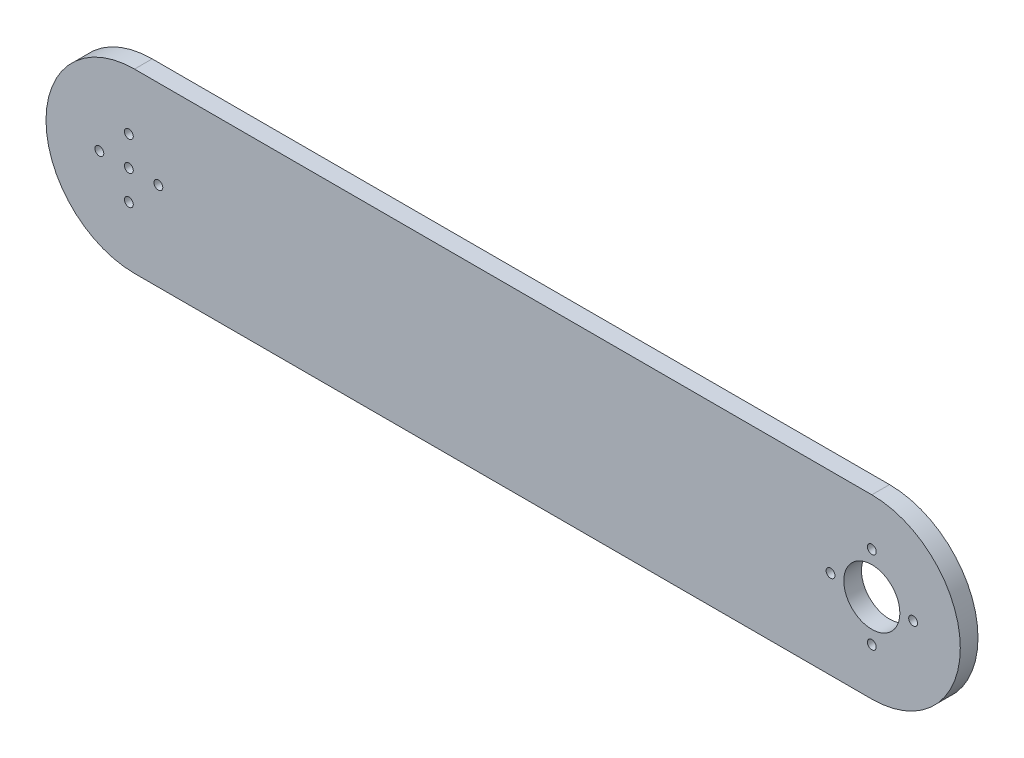
ISO-10303-21;
HEADER;
FILE_DESCRIPTION(('STEP AP214'),'2;1');
FILE_NAME('part.step','',(''),(''),'','','');
FILE_SCHEMA(('AUTOMOTIVE_DESIGN { 1 0 10303 214 1 1 1 1 }'));
ENDSEC;
DATA;
#1=APPLICATION_CONTEXT('core data for automotive mechanical design processes');
#2=APPLICATION_PROTOCOL_DEFINITION('international standard','automotive_design',2000,#1);
#3=PRODUCT_CONTEXT('',#1,'mechanical');
#4=PRODUCT('Part','Part','',(#3));
#5=PRODUCT_RELATED_PRODUCT_CATEGORY('part','',(#4));
#6=PRODUCT_DEFINITION_FORMATION('','',#4);
#7=PRODUCT_DEFINITION_CONTEXT('part definition',#1,'design');
#8=PRODUCT_DEFINITION('design','',#6,#7);
#9=PRODUCT_DEFINITION_SHAPE('','',#8);
#10=(LENGTH_UNIT() NAMED_UNIT(*) SI_UNIT(.MILLI.,.METRE.));
#11=(NAMED_UNIT(*) PLANE_ANGLE_UNIT() SI_UNIT($,.RADIAN.));
#12=(NAMED_UNIT(*) SI_UNIT($,.STERADIAN.) SOLID_ANGLE_UNIT());
#13=UNCERTAINTY_MEASURE_WITH_UNIT(LENGTH_MEASURE(1.E-05),#10,'distance_accuracy_value','');
#14=(GEOMETRIC_REPRESENTATION_CONTEXT(3) GLOBAL_UNCERTAINTY_ASSIGNED_CONTEXT((#13)) GLOBAL_UNIT_ASSIGNED_CONTEXT((#10,
#11,#12)) REPRESENTATION_CONTEXT('',''));
#15=CARTESIAN_POINT('',(0.,0.,0.));
#16=DIRECTION('',(0.,0.,1.));
#17=DIRECTION('',(1.,0.,0.));
#18=AXIS2_PLACEMENT_3D('',#15,#16,#17);
#19=CARTESIAN_POINT('',(370.,30.,6.));
#20=DIRECTION('',(0.,0.,-1.));
#21=DIRECTION('',(-1.,0.,0.));
#22=AXIS2_PLACEMENT_3D('',#19,#20,#21);
#23=CYLINDRICAL_SURFACE('',#22,30.);
#24=CARTESIAN_POINT('',(370.,30.,0.));
#25=DIRECTION('',(0.,0.,1.));
#26=DIRECTION('',(-1.,0.,0.));
#27=AXIS2_PLACEMENT_3D('',#24,#25,#26);
#28=CIRCLE('',#27,30.);
#29=CARTESIAN_POINT('',(370.,0.,0.));
#30=VERTEX_POINT('',#29);
#31=CARTESIAN_POINT('',(370.,60.,0.));
#32=VERTEX_POINT('',#31);
#33=EDGE_CURVE('E116',#30,#32,#28,.T.);
#34=ORIENTED_EDGE('',*,*,#33,.T.);
#35=DIRECTION('',(0.,0.,-1.));
#36=VECTOR('',#35,1.);
#37=CARTESIAN_POINT('',(370.,60.,6.));
#38=LINE('',#37,#36);
#39=CARTESIAN_POINT('',(370.,60.,6.));
#40=VERTEX_POINT('',#39);
#41=EDGE_CURVE('E12',#40,#32,#38,.T.);
#42=ORIENTED_EDGE('',*,*,#41,.F.);
#43=CARTESIAN_POINT('',(370.,30.,6.));
#44=DIRECTION('',(0.,0.,1.));
#45=DIRECTION('',(-1.,0.,0.));
#46=AXIS2_PLACEMENT_3D('',#43,#44,#45);
#47=CIRCLE('',#46,30.);
#48=CARTESIAN_POINT('',(370.,0.,6.));
#49=VERTEX_POINT('',#48);
#50=EDGE_CURVE('E103',#49,#40,#47,.T.);
#51=ORIENTED_EDGE('',*,*,#50,.F.);
#52=DIRECTION('',(0.,0.,-1.));
#53=VECTOR('',#52,1.);
#54=CARTESIAN_POINT('',(370.,0.,6.));
#55=LINE('',#54,#53);
#56=EDGE_CURVE('E112',#49,#30,#55,.T.);
#57=ORIENTED_EDGE('',*,*,#56,.T.);
#58=EDGE_LOOP('',(#34,#42,#51,#57));
#59=FACE_BOUND('',#58,.T.);
#60=ADVANCED_FACE('F48',(#59),#23,.T.);
#61=CARTESIAN_POINT('',(120.,60.,6.));
#62=DIRECTION('',(0.,-1.,0.));
#63=DIRECTION('',(0.,0.,-1.));
#64=AXIS2_PLACEMENT_3D('',#61,#62,#63);
#65=PLANE('',#64);
#66=DIRECTION('',(-1.,0.,0.));
#67=VECTOR('',#66,1.);
#68=CARTESIAN_POINT('',(120.,60.,0.));
#69=LINE('',#68,#67);
#70=CARTESIAN_POINT('',(120.,60.,0.));
#71=VERTEX_POINT('',#70);
#72=EDGE_CURVE('E107',#32,#71,#69,.T.);
#73=ORIENTED_EDGE('',*,*,#72,.T.);
#74=DIRECTION('',(0.,0.,-1.));
#75=VECTOR('',#74,1.);
#76=CARTESIAN_POINT('',(120.,60.,6.));
#77=LINE('',#76,#75);
#78=CARTESIAN_POINT('',(120.,60.,6.));
#79=VERTEX_POINT('',#78);
#80=EDGE_CURVE('E59',#79,#71,#77,.T.);
#81=ORIENTED_EDGE('',*,*,#80,.F.);
#82=DIRECTION('',(-1.,0.,0.));
#83=VECTOR('',#82,1.);
#84=CARTESIAN_POINT('',(120.,60.,6.));
#85=LINE('',#84,#83);
#86=EDGE_CURVE('E98',#40,#79,#85,.T.);
#87=ORIENTED_EDGE('',*,*,#86,.F.);
#88=ORIENTED_EDGE('',*,*,#41,.T.);
#89=EDGE_LOOP('',(#73,#81,#87,#88));
#90=FACE_BOUND('',#89,.T.);
#91=ADVANCED_FACE('F106',(#90),#65,.F.);
#92=CARTESIAN_POINT('',(120.,30.,6.));
#93=DIRECTION('',(0.,0.,-1.));
#94=DIRECTION('',(-1.,0.,0.));
#95=AXIS2_PLACEMENT_3D('',#92,#93,#94);
#96=CYLINDRICAL_SURFACE('',#95,30.);
#97=CARTESIAN_POINT('',(120.,30.,0.));
#98=DIRECTION('',(0.,0.,1.));
#99=DIRECTION('',(1.,0.,0.));
#100=AXIS2_PLACEMENT_3D('',#97,#98,#99);
#101=CIRCLE('',#100,30.);
#102=CARTESIAN_POINT('',(120.,0.,0.));
#103=VERTEX_POINT('',#102);
#104=EDGE_CURVE('E85',#71,#103,#101,.T.);
#105=ORIENTED_EDGE('',*,*,#104,.T.);
#106=DIRECTION('',(0.,0.,-1.));
#107=VECTOR('',#106,1.);
#108=CARTESIAN_POINT('',(120.,0.,6.));
#109=LINE('',#108,#107);
#110=CARTESIAN_POINT('',(120.,0.,6.));
#111=VERTEX_POINT('',#110);
#112=EDGE_CURVE('E108',#111,#103,#109,.T.);
#113=ORIENTED_EDGE('',*,*,#112,.F.);
#114=CARTESIAN_POINT('',(120.,30.,6.));
#115=DIRECTION('',(0.,0.,1.));
#116=DIRECTION('',(1.,0.,0.));
#117=AXIS2_PLACEMENT_3D('',#114,#115,#116);
#118=CIRCLE('',#117,30.);
#119=EDGE_CURVE('E101',#79,#111,#118,.T.);
#120=ORIENTED_EDGE('',*,*,#119,.F.);
#121=ORIENTED_EDGE('',*,*,#80,.T.);
#122=EDGE_LOOP('',(#105,#113,#120,#121));
#123=FACE_BOUND('',#122,.T.);
#124=ADVANCED_FACE('F110',(#123),#96,.T.);
#125=CARTESIAN_POINT('',(120.,0.,6.));
#126=DIRECTION('',(0.,1.,0.));
#127=DIRECTION('',(0.,0.,1.));
#128=AXIS2_PLACEMENT_3D('',#125,#126,#127);
#129=PLANE('',#128);
#130=DIRECTION('',(1.,0.,0.));
#131=VECTOR('',#130,1.);
#132=CARTESIAN_POINT('',(120.,0.,0.));
#133=LINE('',#132,#131);
#134=EDGE_CURVE('E91',#103,#30,#133,.T.);
#135=ORIENTED_EDGE('',*,*,#134,.T.);
#136=ORIENTED_EDGE('',*,*,#56,.F.);
#137=DIRECTION('',(1.,0.,0.));
#138=VECTOR('',#137,1.);
#139=CARTESIAN_POINT('',(120.,0.,6.));
#140=LINE('',#139,#138);
#141=EDGE_CURVE('E68',#111,#49,#140,.T.);
#142=ORIENTED_EDGE('',*,*,#141,.F.);
#143=ORIENTED_EDGE('',*,*,#112,.T.);
#144=EDGE_LOOP('',(#135,#136,#142,#143));
#145=FACE_BOUND('',#144,.T.);
#146=ADVANCED_FACE('F288',(#145),#129,.F.);
#147=CARTESIAN_POINT('',(370.,30.,6.));
#148=DIRECTION('',(0.,0.,-1.));
#149=DIRECTION('',(-1.,0.,0.));
#150=AXIS2_PLACEMENT_3D('',#147,#148,#149);
#151=PLANE('',#150);
#152=CARTESIAN_POINT('',(118.094100000006,19.9999999999992,6.));
#153=DIRECTION('',(0.,0.,-1.));
#154=DIRECTION('',(-1.,0.,0.));
#155=AXIS2_PLACEMENT_3D('',#152,#153,#154);
#156=CIRCLE('',#155,1.5);
#157=CARTESIAN_POINT('',(116.594100000006,19.9999999999992,6.));
#158=VERTEX_POINT('',#157);
#159=EDGE_CURVE('E181',#158,#158,#156,.T.);
#160=ORIENTED_EDGE('',*,*,#159,.T.);
#161=EDGE_LOOP('',(#160));
#162=FACE_BOUND('',#161,.T.);
#163=CARTESIAN_POINT('',(118.094100000006,39.9999999999993,6.));
#164=DIRECTION('',(0.,0.,-1.));
#165=DIRECTION('',(-1.,0.,0.));
#166=AXIS2_PLACEMENT_3D('',#163,#164,#165);
#167=CIRCLE('',#166,1.5);
#168=CARTESIAN_POINT('',(116.594100000006,39.9999999999993,6.));
#169=VERTEX_POINT('',#168);
#170=EDGE_CURVE('E709',#169,#169,#167,.T.);
#171=ORIENTED_EDGE('',*,*,#170,.T.);
#172=EDGE_LOOP('',(#171));
#173=FACE_BOUND('',#172,.T.);
#174=CARTESIAN_POINT('',(128.094100000006,29.9999999999993,6.));
#175=DIRECTION('',(0.,0.,-1.));
#176=DIRECTION('',(-1.,0.,0.));
#177=AXIS2_PLACEMENT_3D('',#174,#175,#176);
#178=CIRCLE('',#177,1.5);
#179=CARTESIAN_POINT('',(126.594100000006,29.9999999999993,6.));
#180=VERTEX_POINT('',#179);
#181=EDGE_CURVE('E699',#180,#180,#178,.T.);
#182=ORIENTED_EDGE('',*,*,#181,.T.);
#183=EDGE_LOOP('',(#182));
#184=FACE_BOUND('',#183,.T.);
#185=CARTESIAN_POINT('',(118.094100000006,29.9999999999993,6.));
#186=DIRECTION('',(0.,0.,-1.));
#187=DIRECTION('',(-1.,0.,0.));
#188=AXIS2_PLACEMENT_3D('',#185,#186,#187);
#189=CIRCLE('',#188,1.5);
#190=CARTESIAN_POINT('',(116.594100000006,29.9999999999993,6.));
#191=VERTEX_POINT('',#190);
#192=EDGE_CURVE('E698',#191,#191,#189,.T.);
#193=ORIENTED_EDGE('',*,*,#192,.T.);
#194=EDGE_LOOP('',(#193));
#195=FACE_BOUND('',#194,.T.);
#196=CARTESIAN_POINT('',(108.094100000006,29.9999999999993,6.));
#197=DIRECTION('',(0.,0.,-1.));
#198=DIRECTION('',(-1.,0.,0.));
#199=AXIS2_PLACEMENT_3D('',#196,#197,#198);
#200=CIRCLE('',#199,1.5);
#201=CARTESIAN_POINT('',(106.594100000006,29.9999999999993,6.));
#202=VERTEX_POINT('',#201);
#203=EDGE_CURVE('E715',#202,#202,#200,.T.);
#204=ORIENTED_EDGE('',*,*,#203,.T.);
#205=EDGE_LOOP('',(#204));
#206=FACE_BOUND('',#205,.T.);
#207=CARTESIAN_POINT('',(370.,16.,6.));
#208=DIRECTION('',(0.,0.,1.));
#209=DIRECTION('',(1.,0.,0.));
#210=AXIS2_PLACEMENT_3D('',#207,#208,#209);
#211=CIRCLE('',#210,1.50000000000002);
#212=CARTESIAN_POINT('',(371.5,16.,6.));
#213=VERTEX_POINT('',#212);
#214=EDGE_CURVE('E599',#213,#213,#211,.T.);
#215=ORIENTED_EDGE('',*,*,#214,.F.);
#216=EDGE_LOOP('',(#215));
#217=FACE_BOUND('',#216,.T.);
#218=CARTESIAN_POINT('',(384.,30.,6.));
#219=DIRECTION('',(0.,0.,1.));
#220=DIRECTION('',(1.,0.,0.));
#221=AXIS2_PLACEMENT_3D('',#218,#219,#220);
#222=CIRCLE('',#221,1.50000000000002);
#223=CARTESIAN_POINT('',(385.5,30.,6.));
#224=VERTEX_POINT('',#223);
#225=EDGE_CURVE('E604',#224,#224,#222,.T.);
#226=ORIENTED_EDGE('',*,*,#225,.F.);
#227=EDGE_LOOP('',(#226));
#228=FACE_BOUND('',#227,.T.);
#229=CARTESIAN_POINT('',(356.,30.,6.));
#230=DIRECTION('',(0.,0.,1.));
#231=DIRECTION('',(1.,0.,0.));
#232=AXIS2_PLACEMENT_3D('',#229,#230,#231);
#233=CIRCLE('',#232,1.50000000000002);
#234=CARTESIAN_POINT('',(357.5,30.,6.));
#235=VERTEX_POINT('',#234);
#236=EDGE_CURVE('E588',#235,#235,#233,.T.);
#237=ORIENTED_EDGE('',*,*,#236,.F.);
#238=EDGE_LOOP('',(#237));
#239=FACE_BOUND('',#238,.T.);
#240=CARTESIAN_POINT('',(370.,44.,6.));
#241=DIRECTION('',(0.,0.,1.));
#242=DIRECTION('',(1.,0.,0.));
#243=AXIS2_PLACEMENT_3D('',#240,#241,#242);
#244=CIRCLE('',#243,1.50000000000002);
#245=CARTESIAN_POINT('',(371.5,44.,6.));
#246=VERTEX_POINT('',#245);
#247=EDGE_CURVE('E583',#246,#246,#244,.T.);
#248=ORIENTED_EDGE('',*,*,#247,.F.);
#249=EDGE_LOOP('',(#248));
#250=FACE_BOUND('',#249,.T.);
#251=CARTESIAN_POINT('',(370.,30.0000000000001,6.));
#252=DIRECTION('',(0.,0.,1.));
#253=DIRECTION('',(1.,0.,0.));
#254=AXIS2_PLACEMENT_3D('',#251,#252,#253);
#255=CIRCLE('',#254,9.50000000000015);
#256=CARTESIAN_POINT('',(379.5,30.0000000000001,6.));
#257=VERTEX_POINT('',#256);
#258=EDGE_CURVE('E127',#257,#257,#255,.T.);
#259=ORIENTED_EDGE('',*,*,#258,.F.);
#260=EDGE_LOOP('',(#259));
#261=FACE_BOUND('',#260,.T.);
#262=ORIENTED_EDGE('',*,*,#50,.T.);
#263=ORIENTED_EDGE('',*,*,#86,.T.);
#264=ORIENTED_EDGE('',*,*,#119,.T.);
#265=ORIENTED_EDGE('',*,*,#141,.T.);
#266=EDGE_LOOP('',(#262,#263,#264,#265));
#267=FACE_BOUND('',#266,.T.);
#268=ADVANCED_FACE('F99',(#162,#173,#184,#195,#206,#217,#228,#239,#250,#261,#267),#151,.F.);
#269=CARTESIAN_POINT('',(370.,30.,0.));
#270=DIRECTION('',(0.,0.,-1.));
#271=DIRECTION('',(-1.,0.,0.));
#272=AXIS2_PLACEMENT_3D('',#269,#270,#271);
#273=PLANE('',#272);
#274=CARTESIAN_POINT('',(150.000000000006,29.9999999999993,0.));
#275=DIRECTION('',(0.,0.,-1.));
#276=DIRECTION('',(-1.,0.,0.));
#277=AXIS2_PLACEMENT_3D('',#274,#275,#276);
#278=CIRCLE('',#277,3.00000000000026);
#279=CARTESIAN_POINT('',(147.000000000006,29.9999999999993,0.));
#280=VERTEX_POINT('',#279);
#281=EDGE_CURVE('E640',#280,#280,#278,.T.);
#282=ORIENTED_EDGE('',*,*,#281,.F.);
#283=EDGE_LOOP('',(#282));
#284=FACE_BOUND('',#283,.T.);
#285=CARTESIAN_POINT('',(118.094100000006,39.9999999999993,0.));
#286=DIRECTION('',(0.,0.,-1.));
#287=DIRECTION('',(-1.,0.,0.));
#288=AXIS2_PLACEMENT_3D('',#285,#286,#287);
#289=CIRCLE('',#288,2.85);
#290=CARTESIAN_POINT('',(115.244100000006,39.9999999999993,0.));
#291=VERTEX_POINT('',#290);
#292=EDGE_CURVE('E643',#291,#291,#289,.T.);
#293=ORIENTED_EDGE('',*,*,#292,.F.);
#294=EDGE_LOOP('',(#293));
#295=FACE_BOUND('',#294,.T.);
#296=CARTESIAN_POINT('',(108.094100000006,29.9999999999993,0.));
#297=DIRECTION('',(0.,0.,-1.));
#298=DIRECTION('',(-1.,0.,0.));
#299=AXIS2_PLACEMENT_3D('',#296,#297,#298);
#300=CIRCLE('',#299,2.85);
#301=CARTESIAN_POINT('',(105.244100000006,29.9999999999993,0.));
#302=VERTEX_POINT('',#301);
#303=EDGE_CURVE('E634',#302,#302,#300,.T.);
#304=ORIENTED_EDGE('',*,*,#303,.F.);
#305=EDGE_LOOP('',(#304));
#306=FACE_BOUND('',#305,.T.);
#307=CARTESIAN_POINT('',(118.094100000006,29.9999999999993,0.));
#308=DIRECTION('',(0.,0.,-1.));
#309=DIRECTION('',(-1.,0.,0.));
#310=AXIS2_PLACEMENT_3D('',#307,#308,#309);
#311=CIRCLE('',#310,2.85);
#312=CARTESIAN_POINT('',(115.244100000006,29.9999999999993,0.));
#313=VERTEX_POINT('',#312);
#314=EDGE_CURVE('E630',#313,#313,#311,.T.);
#315=ORIENTED_EDGE('',*,*,#314,.F.);
#316=EDGE_LOOP('',(#315));
#317=FACE_BOUND('',#316,.T.);
#318=CARTESIAN_POINT('',(128.094100000006,29.9999999999993,0.));
#319=DIRECTION('',(0.,0.,-1.));
#320=DIRECTION('',(-1.,0.,0.));
#321=AXIS2_PLACEMENT_3D('',#318,#319,#320);
#322=CIRCLE('',#321,2.85);
#323=CARTESIAN_POINT('',(125.244100000006,29.9999999999993,0.));
#324=VERTEX_POINT('',#323);
#325=EDGE_CURVE('E637',#324,#324,#322,.T.);
#326=ORIENTED_EDGE('',*,*,#325,.F.);
#327=EDGE_LOOP('',(#326));
#328=FACE_BOUND('',#327,.T.);
#329=CARTESIAN_POINT('',(118.094100000006,19.9999999999992,0.));
#330=DIRECTION('',(0.,0.,-1.));
#331=DIRECTION('',(-1.,0.,0.));
#332=AXIS2_PLACEMENT_3D('',#329,#330,#331);
#333=CIRCLE('',#332,2.85);
#334=CARTESIAN_POINT('',(115.244100000006,19.9999999999992,0.));
#335=VERTEX_POINT('',#334);
#336=EDGE_CURVE('E131',#335,#335,#333,.T.);
#337=ORIENTED_EDGE('',*,*,#336,.F.);
#338=EDGE_LOOP('',(#337));
#339=FACE_BOUND('',#338,.T.);
#340=CARTESIAN_POINT('',(370.,16.,0.));
#341=DIRECTION('',(0.,0.,1.));
#342=DIRECTION('',(1.,0.,0.));
#343=AXIS2_PLACEMENT_3D('',#340,#341,#342);
#344=CIRCLE('',#343,1.50000000000002);
#345=CARTESIAN_POINT('',(371.5,16.,0.));
#346=VERTEX_POINT('',#345);
#347=EDGE_CURVE('E595',#346,#346,#344,.T.);
#348=ORIENTED_EDGE('',*,*,#347,.T.);
#349=EDGE_LOOP('',(#348));
#350=FACE_BOUND('',#349,.T.);
#351=CARTESIAN_POINT('',(384.,30.,0.));
#352=DIRECTION('',(0.,0.,1.));
#353=DIRECTION('',(1.,0.,0.));
#354=AXIS2_PLACEMENT_3D('',#351,#352,#353);
#355=CIRCLE('',#354,1.50000000000002);
#356=CARTESIAN_POINT('',(385.5,30.,0.));
#357=VERTEX_POINT('',#356);
#358=EDGE_CURVE('E611',#357,#357,#355,.T.);
#359=ORIENTED_EDGE('',*,*,#358,.T.);
#360=EDGE_LOOP('',(#359));
#361=FACE_BOUND('',#360,.T.);
#362=CARTESIAN_POINT('',(356.,30.,0.));
#363=DIRECTION('',(0.,0.,1.));
#364=DIRECTION('',(1.,0.,0.));
#365=AXIS2_PLACEMENT_3D('',#362,#363,#364);
#366=CIRCLE('',#365,1.50000000000002);
#367=CARTESIAN_POINT('',(357.5,30.,0.));
#368=VERTEX_POINT('',#367);
#369=EDGE_CURVE('E585',#368,#368,#366,.T.);
#370=ORIENTED_EDGE('',*,*,#369,.T.);
#371=EDGE_LOOP('',(#370));
#372=FACE_BOUND('',#371,.T.);
#373=CARTESIAN_POINT('',(370.,44.,0.));
#374=DIRECTION('',(0.,0.,1.));
#375=DIRECTION('',(1.,0.,0.));
#376=AXIS2_PLACEMENT_3D('',#373,#374,#375);
#377=CIRCLE('',#376,1.50000000000002);
#378=CARTESIAN_POINT('',(371.5,44.,0.));
#379=VERTEX_POINT('',#378);
#380=EDGE_CURVE('E580',#379,#379,#377,.T.);
#381=ORIENTED_EDGE('',*,*,#380,.T.);
#382=EDGE_LOOP('',(#381));
#383=FACE_BOUND('',#382,.T.);
#384=CARTESIAN_POINT('',(370.,30.0000000000001,0.));
#385=DIRECTION('',(0.,0.,-1.));
#386=DIRECTION('',(-1.,0.,0.));
#387=AXIS2_PLACEMENT_3D('',#384,#385,#386);
#388=CIRCLE('',#387,9.50000000000015);
#389=CARTESIAN_POINT('',(360.5,30.0000000000001,0.));
#390=VERTEX_POINT('',#389);
#391=EDGE_CURVE('E119',#390,#390,#388,.T.);
#392=ORIENTED_EDGE('',*,*,#391,.F.);
#393=EDGE_LOOP('',(#392));
#394=FACE_BOUND('',#393,.T.);
#395=ORIENTED_EDGE('',*,*,#33,.F.);
#396=ORIENTED_EDGE('',*,*,#134,.F.);
#397=ORIENTED_EDGE('',*,*,#104,.F.);
#398=ORIENTED_EDGE('',*,*,#72,.F.);
#399=EDGE_LOOP('',(#395,#396,#397,#398));
#400=FACE_BOUND('',#399,.T.);
#401=ADVANCED_FACE('F276',(#284,#295,#306,#317,#328,#339,#350,#361,#372,#383,#394,#400),#273,.T.);
#402=CARTESIAN_POINT('',(370.,30.0000000000001,-214.));
#403=DIRECTION('',(0.,0.,1.));
#404=DIRECTION('',(1.,0.,0.));
#405=AXIS2_PLACEMENT_3D('',#402,#403,#404);
#406=CYLINDRICAL_SURFACE('',#405,9.50000000000015);
#407=ORIENTED_EDGE('',*,*,#391,.T.);
#408=EDGE_LOOP('',(#407));
#409=FACE_BOUND('',#408,.T.);
#410=ORIENTED_EDGE('',*,*,#258,.T.);
#411=EDGE_LOOP('',(#410));
#412=FACE_BOUND('',#411,.T.);
#413=ADVANCED_FACE('F278',(#409,#412),#406,.F.);
#414=CARTESIAN_POINT('',(370.,44.,0.));
#415=DIRECTION('',(0.,0.,1.));
#416=DIRECTION('',(1.,0.,0.));
#417=AXIS2_PLACEMENT_3D('',#414,#415,#416);
#418=CYLINDRICAL_SURFACE('',#417,1.50000000000002);
#419=ORIENTED_EDGE('',*,*,#380,.F.);
#420=EDGE_LOOP('',(#419));
#421=FACE_BOUND('',#420,.T.);
#422=ORIENTED_EDGE('',*,*,#247,.T.);
#423=EDGE_LOOP('',(#422));
#424=FACE_BOUND('',#423,.T.);
#425=ADVANCED_FACE('F285',(#421,#424),#418,.F.);
#426=CARTESIAN_POINT('',(356.,30.,0.));
#427=DIRECTION('',(0.,0.,1.));
#428=DIRECTION('',(1.,0.,0.));
#429=AXIS2_PLACEMENT_3D('',#426,#427,#428);
#430=CYLINDRICAL_SURFACE('',#429,1.50000000000002);
#431=ORIENTED_EDGE('',*,*,#369,.F.);
#432=EDGE_LOOP('',(#431));
#433=FACE_BOUND('',#432,.T.);
#434=ORIENTED_EDGE('',*,*,#236,.T.);
#435=EDGE_LOOP('',(#434));
#436=FACE_BOUND('',#435,.T.);
#437=ADVANCED_FACE('F498',(#433,#436),#430,.F.);
#438=CARTESIAN_POINT('',(384.,30.,0.));
#439=DIRECTION('',(0.,0.,1.));
#440=DIRECTION('',(1.,0.,0.));
#441=AXIS2_PLACEMENT_3D('',#438,#439,#440);
#442=CYLINDRICAL_SURFACE('',#441,1.50000000000002);
#443=ORIENTED_EDGE('',*,*,#358,.F.);
#444=EDGE_LOOP('',(#443));
#445=FACE_BOUND('',#444,.T.);
#446=ORIENTED_EDGE('',*,*,#225,.T.);
#447=EDGE_LOOP('',(#446));
#448=FACE_BOUND('',#447,.T.);
#449=ADVANCED_FACE('F489',(#445,#448),#442,.F.);
#450=CARTESIAN_POINT('',(370.,16.,0.));
#451=DIRECTION('',(0.,0.,1.));
#452=DIRECTION('',(1.,0.,0.));
#453=AXIS2_PLACEMENT_3D('',#450,#451,#452);
#454=CYLINDRICAL_SURFACE('',#453,1.50000000000002);
#455=ORIENTED_EDGE('',*,*,#347,.F.);
#456=EDGE_LOOP('',(#455));
#457=FACE_BOUND('',#456,.T.);
#458=ORIENTED_EDGE('',*,*,#214,.T.);
#459=EDGE_LOOP('',(#458));
#460=FACE_BOUND('',#459,.T.);
#461=ADVANCED_FACE('F161',(#457,#460),#454,.F.);
#462=CARTESIAN_POINT('',(118.094100000006,19.9999999999992,0.3));
#463=DIRECTION('',(0.,0.,-1.));
#464=DIRECTION('',(-1.,0.,0.));
#465=AXIS2_PLACEMENT_3D('',#462,#463,#464);
#466=CYLINDRICAL_SURFACE('',#465,2.85);
#467=CARTESIAN_POINT('',(118.094100000006,19.9999999999992,0.3));
#468=DIRECTION('',(0.,0.,-1.));
#469=DIRECTION('',(-1.,0.,0.));
#470=AXIS2_PLACEMENT_3D('',#467,#468,#469);
#471=CIRCLE('',#470,2.85);
#472=CARTESIAN_POINT('',(115.244100000006,19.9999999999992,0.3));
#473=VERTEX_POINT('',#472);
#474=EDGE_CURVE('E171',#473,#473,#471,.T.);
#475=ORIENTED_EDGE('',*,*,#474,.F.);
#476=EDGE_LOOP('',(#475));
#477=FACE_BOUND('',#476,.T.);
#478=ORIENTED_EDGE('',*,*,#336,.T.);
#479=EDGE_LOOP('',(#478));
#480=FACE_BOUND('',#479,.T.);
#481=ADVANCED_FACE('F156',(#477,#480),#466,.F.);
#482=CARTESIAN_POINT('',(128.094100000006,29.9999999999993,0.3));
#483=DIRECTION('',(0.,0.,-1.));
#484=DIRECTION('',(-1.,0.,0.));
#485=AXIS2_PLACEMENT_3D('',#482,#483,#484);
#486=CYLINDRICAL_SURFACE('',#485,2.85);
#487=CARTESIAN_POINT('',(128.094100000006,29.9999999999993,0.3));
#488=DIRECTION('',(0.,0.,-1.));
#489=DIRECTION('',(-1.,0.,0.));
#490=AXIS2_PLACEMENT_3D('',#487,#488,#489);
#491=CIRCLE('',#490,2.85);
#492=CARTESIAN_POINT('',(125.244100000006,29.9999999999993,0.3));
#493=VERTEX_POINT('',#492);
#494=EDGE_CURVE('E633',#493,#493,#491,.T.);
#495=ORIENTED_EDGE('',*,*,#494,.F.);
#496=EDGE_LOOP('',(#495));
#497=FACE_BOUND('',#496,.T.);
#498=ORIENTED_EDGE('',*,*,#325,.T.);
#499=EDGE_LOOP('',(#498));
#500=FACE_BOUND('',#499,.T.);
#501=ADVANCED_FACE('F160',(#497,#500),#486,.F.);
#502=CARTESIAN_POINT('',(128.094100000006,29.9999999999993,0.3));
#503=DIRECTION('',(0.,0.,-1.));
#504=DIRECTION('',(-1.,0.,0.));
#505=AXIS2_PLACEMENT_3D('',#502,#503,#504);
#506=PLANE('',#505);
#507=CARTESIAN_POINT('',(128.094100000006,29.9999999999993,0.3));
#508=DIRECTION('',(0.,0.,1.));
#509=DIRECTION('',(1.,0.,0.));
#510=AXIS2_PLACEMENT_3D('',#507,#508,#509);
#511=CIRCLE('',#510,2.57173319581993);
#512=CARTESIAN_POINT('',(130.665833195826,29.9999999999993,0.3));
#513=VERTEX_POINT('',#512);
#514=EDGE_CURVE('E128',#513,#513,#511,.F.);
#515=ORIENTED_EDGE('',*,*,#514,.F.);
#516=EDGE_LOOP('',(#515));
#517=FACE_BOUND('',#516,.T.);
#518=ORIENTED_EDGE('',*,*,#494,.T.);
#519=EDGE_LOOP('',(#518));
#520=FACE_BOUND('',#519,.T.);
#521=ADVANCED_FACE('F154',(#517,#520),#506,.T.);
#522=CARTESIAN_POINT('',(118.094100000006,29.9999999999993,0.3));
#523=DIRECTION('',(0.,0.,-1.));
#524=DIRECTION('',(-1.,0.,0.));
#525=AXIS2_PLACEMENT_3D('',#522,#523,#524);
#526=CYLINDRICAL_SURFACE('',#525,2.85);
#527=CARTESIAN_POINT('',(118.094100000006,29.9999999999993,0.3));
#528=DIRECTION('',(0.,0.,-1.));
#529=DIRECTION('',(-1.,0.,0.));
#530=AXIS2_PLACEMENT_3D('',#527,#528,#529);
#531=CIRCLE('',#530,2.85);
#532=CARTESIAN_POINT('',(115.244100000006,29.9999999999993,0.3));
#533=VERTEX_POINT('',#532);
#534=EDGE_CURVE('E132',#533,#533,#531,.T.);
#535=ORIENTED_EDGE('',*,*,#534,.F.);
#536=EDGE_LOOP('',(#535));
#537=FACE_BOUND('',#536,.T.);
#538=ORIENTED_EDGE('',*,*,#314,.T.);
#539=EDGE_LOOP('',(#538));
#540=FACE_BOUND('',#539,.T.);
#541=ADVANCED_FACE('F143',(#537,#540),#526,.F.);
#542=CARTESIAN_POINT('',(108.094100000006,29.9999999999993,0.3));
#543=DIRECTION('',(0.,0.,-1.));
#544=DIRECTION('',(-1.,0.,0.));
#545=AXIS2_PLACEMENT_3D('',#542,#543,#544);
#546=CYLINDRICAL_SURFACE('',#545,2.85);
#547=CARTESIAN_POINT('',(108.094100000006,29.9999999999993,0.3));
#548=DIRECTION('',(0.,0.,-1.));
#549=DIRECTION('',(-1.,0.,0.));
#550=AXIS2_PLACEMENT_3D('',#547,#548,#549);
#551=CIRCLE('',#550,2.85);
#552=CARTESIAN_POINT('',(105.244100000006,29.9999999999993,0.3));
#553=VERTEX_POINT('',#552);
#554=EDGE_CURVE('E180',#553,#553,#551,.T.);
#555=ORIENTED_EDGE('',*,*,#554,.F.);
#556=EDGE_LOOP('',(#555));
#557=FACE_BOUND('',#556,.T.);
#558=ORIENTED_EDGE('',*,*,#303,.T.);
#559=EDGE_LOOP('',(#558));
#560=FACE_BOUND('',#559,.T.);
#561=ADVANCED_FACE('F153',(#557,#560),#546,.F.);
#562=CARTESIAN_POINT('',(118.094100000006,39.9999999999993,0.3));
#563=DIRECTION('',(0.,0.,-1.));
#564=DIRECTION('',(-1.,0.,0.));
#565=AXIS2_PLACEMENT_3D('',#562,#563,#564);
#566=CYLINDRICAL_SURFACE('',#565,2.85);
#567=CARTESIAN_POINT('',(118.094100000006,39.9999999999993,0.3));
#568=DIRECTION('',(0.,0.,-1.));
#569=DIRECTION('',(-1.,0.,0.));
#570=AXIS2_PLACEMENT_3D('',#567,#568,#569);
#571=CIRCLE('',#570,2.85);
#572=CARTESIAN_POINT('',(115.244100000006,39.9999999999993,0.3));
#573=VERTEX_POINT('',#572);
#574=EDGE_CURVE('E629',#573,#573,#571,.T.);
#575=ORIENTED_EDGE('',*,*,#574,.F.);
#576=EDGE_LOOP('',(#575));
#577=FACE_BOUND('',#576,.T.);
#578=ORIENTED_EDGE('',*,*,#292,.T.);
#579=EDGE_LOOP('',(#578));
#580=FACE_BOUND('',#579,.T.);
#581=ADVANCED_FACE('F251',(#577,#580),#566,.F.);
#582=CARTESIAN_POINT('',(118.094100000006,39.9999999999993,0.3));
#583=DIRECTION('',(0.,0.,-1.));
#584=DIRECTION('',(-1.,0.,0.));
#585=AXIS2_PLACEMENT_3D('',#582,#583,#584);
#586=PLANE('',#585);
#587=CARTESIAN_POINT('',(118.094100000006,39.9999999999993,0.3));
#588=DIRECTION('',(0.,0.,-1.));
#589=DIRECTION('',(-1.,0.,0.));
#590=AXIS2_PLACEMENT_3D('',#587,#588,#589);
#591=CIRCLE('',#590,2.63225806451613);
#592=CARTESIAN_POINT('',(115.46184193549,39.9999999999993,0.3));
#593=VERTEX_POINT('',#592);
#594=EDGE_CURVE('E237',#593,#593,#591,.T.);
#595=ORIENTED_EDGE('',*,*,#594,.F.);
#596=EDGE_LOOP('',(#595));
#597=FACE_BOUND('',#596,.T.);
#598=ORIENTED_EDGE('',*,*,#574,.T.);
#599=EDGE_LOOP('',(#598));
#600=FACE_BOUND('',#599,.T.);
#601=ADVANCED_FACE('F257',(#597,#600),#586,.T.);
#602=CARTESIAN_POINT('',(150.000000000006,29.9999999999993,0.3));
#603=DIRECTION('',(0.,0.,-1.));
#604=DIRECTION('',(-1.,0.,0.));
#605=AXIS2_PLACEMENT_3D('',#602,#603,#604);
#606=CYLINDRICAL_SURFACE('',#605,3.00000000000026);
#607=CARTESIAN_POINT('',(150.000000000006,29.9999999999993,0.3));
#608=DIRECTION('',(0.,0.,-1.));
#609=DIRECTION('',(-1.,0.,0.));
#610=AXIS2_PLACEMENT_3D('',#607,#608,#609);
#611=CIRCLE('',#610,3.00000000000026);
#612=CARTESIAN_POINT('',(147.000000000006,29.9999999999993,0.3));
#613=VERTEX_POINT('',#612);
#614=EDGE_CURVE('E590',#613,#613,#611,.T.);
#615=ORIENTED_EDGE('',*,*,#614,.F.);
#616=EDGE_LOOP('',(#615));
#617=FACE_BOUND('',#616,.T.);
#618=ORIENTED_EDGE('',*,*,#281,.T.);
#619=EDGE_LOOP('',(#618));
#620=FACE_BOUND('',#619,.T.);
#621=ADVANCED_FACE('F253',(#617,#620),#606,.F.);
#622=CARTESIAN_POINT('',(150.000000000006,29.9999999999993,0.3));
#623=DIRECTION('',(0.,0.,-1.));
#624=DIRECTION('',(-1.,0.,0.));
#625=AXIS2_PLACEMENT_3D('',#622,#623,#624);
#626=PLANE('',#625);
#627=ORIENTED_EDGE('',*,*,#614,.T.);
#628=EDGE_LOOP('',(#627));
#629=FACE_BOUND('',#628,.T.);
#630=ADVANCED_FACE('F327',(#629),#626,.T.);
#631=CARTESIAN_POINT('',(126.732099737835,32.5034886230702,0.));
#632=CARTESIAN_POINT('',(128.476256088531,31.4505022316429,1.86));
#633=CARTESIAN_POINT('',(121.725122491693,29.7794880987281,0.));
#634=CARTESIAN_POINT('',(125.575251625244,32.214814408693,1.86));
#635=CARTESIAN_POINT('',(124.449123016035,24.7725108525861,0.));
#636=CARTESIAN_POINT('',(124.810939448194,29.3138099454057,1.86));
#637=CARTESIAN_POINT('',(129.456100262177,27.4965113769283,0.));
#638=CARTESIAN_POINT('',(127.711943911481,28.5494977683556,1.86));
#639=CARTESIAN_POINT('',(134.463077508319,30.2205119012704,0.));
#640=CARTESIAN_POINT('',(130.612948374769,27.7851855913055,1.86));
#641=CARTESIAN_POINT('',(131.739076983977,35.2274891474124,0.));
#642=CARTESIAN_POINT('',(131.377260551819,30.6861900545928,1.86));
#643=CARTESIAN_POINT('',(126.732099737835,32.5034886230702,0.));
#644=CARTESIAN_POINT('',(128.476256088531,31.4505022316429,1.86));
#645=(BOUNDED_SURFACE() B_SPLINE_SURFACE(3,1,((#631,#632),(#633,#634),(#635,#636),(#637,#638),
(#639,#640),(#641,#642),(#643,#644)),.UNSPECIFIED.,.T.,.F.,.F.) B_SPLINE_SURFACE_WITH_KNOTS((4,
3,4),(2,2),(0.,0.5,1.),(0.,1.),
.UNSPECIFIED.) GEOMETRIC_REPRESENTATION_ITEM() RATIONAL_B_SPLINE_SURFACE(((1.,1.),
(0.333333333333333,0.333333333333333),(0.333333333333333,0.333333333333333),(1.,1.),
(0.333333333333333,0.333333333333333),(0.333333333333333,0.333333333333333),(1.,1.))) REPRESENTATION_ITEM('') SURFACE());
#646=CARTESIAN_POINT('',(128.476256088531,31.450502231643,1.85999999999985));
#647=CARTESIAN_POINT('',(125.575251625244,32.2148144086928,1.85999999999985));
#648=CARTESIAN_POINT('',(124.810939448194,29.3138099454054,1.85999999999985));
#649=CARTESIAN_POINT('',(127.711943911481,28.5494977683555,1.85999999999985));
#650=CARTESIAN_POINT('',(130.612948374769,27.7851855913057,1.85999999999985));
#651=CARTESIAN_POINT('',(131.377260551819,30.6861900545931,1.85999999999985));
#652=CARTESIAN_POINT('',(128.476256088531,31.450502231643,1.85999999999985));
#653=(BOUNDED_CURVE() B_SPLINE_CURVE(3,(#646,#647,#648,#649,#650,#651,#652),.UNSPECIFIED.,.T.,
.F.) B_SPLINE_CURVE_WITH_KNOTS((4,3,4),(0.,0.5,1.),
.UNSPECIFIED.) CURVE() GEOMETRIC_REPRESENTATION_ITEM() RATIONAL_B_SPLINE_CURVE((1.,
0.333333333333333,0.333333333333333,1.,0.333333333333333,0.333333333333333,1.)) REPRESENTATION_ITEM(''));
#654=CARTESIAN_POINT('',(128.476256088531,31.450502231643,1.85999999999985));
#655=VERTEX_POINT('',#654);
#656=EDGE_CURVE('E704',#655,#655,#653,.F.);
#657=ORIENTED_EDGE('',*,*,#514,.T.);
#658=EDGE_LOOP('',(#657));
#659=FACE_BOUND('',#658,.T.);
#660=ORIENTED_EDGE('',*,*,#656,.F.);
#661=EDGE_LOOP('',(#660));
#662=FACE_BOUND('',#661,.T.);
#663=ADVANCED_FACE('F321',(#659,#662),#645,.F.);
#664=CARTESIAN_POINT('',(116.824217171232,32.551450097725,0.3));
#665=CARTESIAN_POINT('',(119.35039206007,30.8195915201007,1.86));
#666=CARTESIAN_POINT('',(111.721316975781,30.0116844401766,0.3));
#667=CARTESIAN_POINT('',(117.711209019867,33.3321756402271,1.86));
#668=CARTESIAN_POINT('',(114.261082633329,24.9087842447252,0.3));
#669=CARTESIAN_POINT('',(115.19862489974,31.6929926000243,1.86));
#670=CARTESIAN_POINT('',(119.363982828781,27.4485499022735,0.3));
#671=CARTESIAN_POINT('',(116.837807939943,29.1804084798978,1.86));
#672=CARTESIAN_POINT('',(124.466883024232,29.9883155598219,0.3));
#673=CARTESIAN_POINT('',(118.476990980146,26.6678243597714,1.86));
#674=CARTESIAN_POINT('',(121.927117366684,35.0912157552733,0.3));
#675=CARTESIAN_POINT('',(120.989575100272,28.3070073999742,1.86));
#676=CARTESIAN_POINT('',(116.824217171232,32.551450097725,0.3));
#677=CARTESIAN_POINT('',(119.35039206007,30.8195915201007,1.86));
#678=(BOUNDED_SURFACE() B_SPLINE_SURFACE(3,1,((#664,#665),(#666,#667),(#668,#669),(#670,#671),
(#672,#673),(#674,#675),(#676,#677)),.UNSPECIFIED.,.T.,.F.,.F.) B_SPLINE_SURFACE_WITH_KNOTS((4,
3,4),(2,2),(0.,0.5,1.),(0.,1.),
.UNSPECIFIED.) GEOMETRIC_REPRESENTATION_ITEM() RATIONAL_B_SPLINE_SURFACE(((1.,1.),
(0.333333333333333,0.333333333333333),(0.333333333333333,0.333333333333333),(1.,1.),
(0.333333333333333,0.333333333333334),(0.333333333333333,0.333333333333334),(1.,1.))) REPRESENTATION_ITEM('') SURFACE());
#679=CARTESIAN_POINT('',(119.35039206007,30.8195915201007,1.86));
#680=CARTESIAN_POINT('',(117.711209019867,33.3321756402271,1.86));
#681=CARTESIAN_POINT('',(115.19862489974,31.6929926000243,1.86));
#682=CARTESIAN_POINT('',(116.837807939943,29.1804084798978,1.86));
#683=CARTESIAN_POINT('',(118.476990980146,26.6678243597714,1.86));
#684=CARTESIAN_POINT('',(120.989575100272,28.3070073999742,1.86));
#685=CARTESIAN_POINT('',(119.35039206007,30.8195915201007,1.86));
#686=(BOUNDED_CURVE() B_SPLINE_CURVE(3,(#679,#680,#681,#682,#683,#684,#685),.UNSPECIFIED.,.T.,
.F.) B_SPLINE_CURVE_WITH_KNOTS((4,3,4),(0.,0.5,1.),
.UNSPECIFIED.) CURVE() GEOMETRIC_REPRESENTATION_ITEM() RATIONAL_B_SPLINE_CURVE((1.,
0.333333333333333,0.333333333333333,1.,0.333333333333334,0.333333333333334,1.)) REPRESENTATION_ITEM(''));
#687=CARTESIAN_POINT('',(119.35039206007,30.8195915201007,1.86));
#688=VERTEX_POINT('',#687);
#689=EDGE_CURVE('E695',#688,#688,#686,.F.);
#690=ORIENTED_EDGE('',*,*,#534,.T.);
#691=EDGE_LOOP('',(#690));
#692=FACE_BOUND('',#691,.T.);
#693=ORIENTED_EDGE('',*,*,#689,.F.);
#694=EDGE_LOOP('',(#693));
#695=FACE_BOUND('',#694,.T.);
#696=ADVANCED_FACE('F326',(#692,#695),#678,.F.);
#697=CARTESIAN_POINT('',(118.094100000006,39.9999999999993,1.86));
#698=DIRECTION('',(0.,0.,-1.));
#699=DIRECTION('',(-1.,0.,0.));
#700=AXIS2_PLACEMENT_3D('',#697,#698,#699);
#701=CONICAL_SURFACE('',#700,1.5,0.627836593811791);
#702=ORIENTED_EDGE('',*,*,#594,.T.);
#703=EDGE_LOOP('',(#702));
#704=FACE_BOUND('',#703,.T.);
#705=CARTESIAN_POINT('',(118.094100000006,39.9999999999993,1.86));
#706=DIRECTION('',(0.,0.,-1.));
#707=DIRECTION('',(-1.,0.,0.));
#708=AXIS2_PLACEMENT_3D('',#705,#706,#707);
#709=CIRCLE('',#708,1.5);
#710=CARTESIAN_POINT('',(116.594100000006,39.9999999999993,1.86));
#711=VERTEX_POINT('',#710);
#712=EDGE_CURVE('E714',#711,#711,#709,.T.);
#713=ORIENTED_EDGE('',*,*,#712,.F.);
#714=EDGE_LOOP('',(#713));
#715=FACE_BOUND('',#714,.T.);
#716=ADVANCED_FACE('F213',(#704,#715),#701,.F.);
#717=CARTESIAN_POINT('',(106.929450137008,32.6011710240992,0.3));
#718=CARTESIAN_POINT('',(108.926279517118,31.2479892833264,1.86));
#719=CARTESIAN_POINT('',(101.727108088808,30.271871298102,0.3));
#720=CARTESIAN_POINT('',(106.430300950464,32.9123483175502,1.86));
#721=CARTESIAN_POINT('',(104.056407814805,25.0695292499021,0.3));
#722=CARTESIAN_POINT('',(104.76594191624,30.416369750896,1.86));
#723=CARTESIAN_POINT('',(109.258749863005,27.3988289758993,0.3));
#724=CARTESIAN_POINT('',(107.261920482894,28.7520107166721,1.86));
#725=CARTESIAN_POINT('',(114.461091911205,29.7281287018964,0.3));
#726=CARTESIAN_POINT('',(109.757899049549,27.0876516824483,1.86));
#727=CARTESIAN_POINT('',(112.131792185208,34.9304707500964,0.3));
#728=CARTESIAN_POINT('',(111.422258083773,29.5836302491025,1.86));
#729=CARTESIAN_POINT('',(106.929450137008,32.6011710240992,0.3));
#730=CARTESIAN_POINT('',(108.926279517118,31.2479892833264,1.86));
#731=(BOUNDED_SURFACE() B_SPLINE_SURFACE(3,1,((#717,#718),(#719,#720),(#721,#722),(#723,#724),
(#725,#726),(#727,#728),(#729,#730)),.UNSPECIFIED.,.T.,.F.,.F.) B_SPLINE_SURFACE_WITH_KNOTS((4,
3,4),(2,2),(0.,0.5,1.),(0.,1.),
.UNSPECIFIED.) GEOMETRIC_REPRESENTATION_ITEM() RATIONAL_B_SPLINE_SURFACE(((1.,1.),
(0.333333333333333,0.333333333333333),(0.333333333333333,0.333333333333333),(1.,1.),
(0.333333333333333,0.333333333333333),(0.333333333333333,0.333333333333333),(1.,1.))) REPRESENTATION_ITEM('') SURFACE());
#732=CARTESIAN_POINT('',(108.926279517118,31.2479892833264,1.85999999999998));
#733=CARTESIAN_POINT('',(106.430300950464,32.9123483175502,1.85999999999998));
#734=CARTESIAN_POINT('',(104.76594191624,30.416369750896,1.85999999999998));
#735=CARTESIAN_POINT('',(107.261920482894,28.7520107166721,1.85999999999998));
#736=CARTESIAN_POINT('',(109.757899049549,27.0876516824483,1.85999999999998));
#737=CARTESIAN_POINT('',(111.422258083773,29.5836302491025,1.85999999999998));
#738=CARTESIAN_POINT('',(108.926279517118,31.2479892833264,1.85999999999998));
#739=(BOUNDED_CURVE() B_SPLINE_CURVE(3,(#732,#733,#734,#735,#736,#737,#738),.UNSPECIFIED.,.T.,
.F.) B_SPLINE_CURVE_WITH_KNOTS((4,3,4),(0.,0.5,1.),
.UNSPECIFIED.) CURVE() GEOMETRIC_REPRESENTATION_ITEM() RATIONAL_B_SPLINE_CURVE((1.,
0.333333333333333,0.333333333333333,1.,0.333333333333333,0.333333333333333,1.)) REPRESENTATION_ITEM(''));
#740=CARTESIAN_POINT('',(108.926279517118,31.2479892833264,1.85999999999998));
#741=VERTEX_POINT('',#740);
#742=EDGE_CURVE('E701',#741,#741,#739,.F.);
#743=ORIENTED_EDGE('',*,*,#554,.T.);
#744=EDGE_LOOP('',(#743));
#745=FACE_BOUND('',#744,.T.);
#746=ORIENTED_EDGE('',*,*,#742,.F.);
#747=EDGE_LOOP('',(#746));
#748=FACE_BOUND('',#747,.T.);
#749=ADVANCED_FACE('F201',(#745,#748),#731,.F.);
#750=CARTESIAN_POINT('',(118.094100000006,19.9999999999992,1.86));
#751=DIRECTION('',(0.,0.,-1.));
#752=DIRECTION('',(-1.,0.,0.));
#753=AXIS2_PLACEMENT_3D('',#750,#751,#752);
#754=CONICAL_SURFACE('',#753,1.5,0.713358098010622);
#755=ORIENTED_EDGE('',*,*,#474,.T.);
#756=EDGE_LOOP('',(#755));
#757=FACE_BOUND('',#756,.T.);
#758=CARTESIAN_POINT('',(118.094100000006,19.9999999999992,1.86));
#759=DIRECTION('',(0.,0.,-1.));
#760=DIRECTION('',(-1.,0.,0.));
#761=AXIS2_PLACEMENT_3D('',#758,#759,#760);
#762=CIRCLE('',#761,1.5);
#763=CARTESIAN_POINT('',(116.594100000006,19.9999999999992,1.86));
#764=VERTEX_POINT('',#763);
#765=EDGE_CURVE('E717',#764,#764,#762,.T.);
#766=ORIENTED_EDGE('',*,*,#765,.F.);
#767=EDGE_LOOP('',(#766));
#768=FACE_BOUND('',#767,.T.);
#769=ADVANCED_FACE('F212',(#757,#768),#754,.F.);
#770=CARTESIAN_POINT('',(108.094100000006,29.9999999999993,6.));
#771=DIRECTION('',(0.,0.,-1.));
#772=DIRECTION('',(-1.,0.,0.));
#773=AXIS2_PLACEMENT_3D('',#770,#771,#772);
#774=CYLINDRICAL_SURFACE('',#773,1.5);
#775=ORIENTED_EDGE('',*,*,#203,.F.);
#776=EDGE_LOOP('',(#775));
#777=FACE_BOUND('',#776,.T.);
#778=ORIENTED_EDGE('',*,*,#742,.T.);
#779=EDGE_LOOP('',(#778));
#780=FACE_BOUND('',#779,.T.);
#781=ADVANCED_FACE('F365',(#777,#780),#774,.F.);
#782=CARTESIAN_POINT('',(118.094100000006,29.9999999999993,6.));
#783=DIRECTION('',(0.,0.,-1.));
#784=DIRECTION('',(-1.,0.,0.));
#785=AXIS2_PLACEMENT_3D('',#782,#783,#784);
#786=CYLINDRICAL_SURFACE('',#785,1.5);
#787=ORIENTED_EDGE('',*,*,#192,.F.);
#788=EDGE_LOOP('',(#787));
#789=FACE_BOUND('',#788,.T.);
#790=ORIENTED_EDGE('',*,*,#689,.T.);
#791=EDGE_LOOP('',(#790));
#792=FACE_BOUND('',#791,.T.);
#793=ADVANCED_FACE('F375',(#789,#792),#786,.F.);
#794=CARTESIAN_POINT('',(128.094100000006,29.9999999999993,6.));
#795=DIRECTION('',(0.,0.,-1.));
#796=DIRECTION('',(-1.,0.,0.));
#797=AXIS2_PLACEMENT_3D('',#794,#795,#796);
#798=CYLINDRICAL_SURFACE('',#797,1.5);
#799=ORIENTED_EDGE('',*,*,#181,.F.);
#800=EDGE_LOOP('',(#799));
#801=FACE_BOUND('',#800,.T.);
#802=ORIENTED_EDGE('',*,*,#656,.T.);
#803=EDGE_LOOP('',(#802));
#804=FACE_BOUND('',#803,.T.);
#805=ADVANCED_FACE('F386',(#801,#804),#798,.F.);
#806=CARTESIAN_POINT('',(118.094100000006,39.9999999999993,6.));
#807=DIRECTION('',(0.,0.,-1.));
#808=DIRECTION('',(-1.,0.,0.));
#809=AXIS2_PLACEMENT_3D('',#806,#807,#808);
#810=CYLINDRICAL_SURFACE('',#809,1.5);
#811=ORIENTED_EDGE('',*,*,#170,.F.);
#812=EDGE_LOOP('',(#811));
#813=FACE_BOUND('',#812,.T.);
#814=ORIENTED_EDGE('',*,*,#712,.T.);
#815=EDGE_LOOP('',(#814));
#816=FACE_BOUND('',#815,.T.);
#817=ADVANCED_FACE('F396',(#813,#816),#810,.F.);
#818=CARTESIAN_POINT('',(118.094100000006,19.9999999999992,6.));
#819=DIRECTION('',(0.,0.,-1.));
#820=DIRECTION('',(-1.,0.,0.));
#821=AXIS2_PLACEMENT_3D('',#818,#819,#820);
#822=CYLINDRICAL_SURFACE('',#821,1.5);
#823=ORIENTED_EDGE('',*,*,#159,.F.);
#824=EDGE_LOOP('',(#823));
#825=FACE_BOUND('',#824,.T.);
#826=ORIENTED_EDGE('',*,*,#765,.T.);
#827=EDGE_LOOP('',(#826));
#828=FACE_BOUND('',#827,.T.);
#829=ADVANCED_FACE('F406',(#825,#828),#822,.F.);
#830=CLOSED_SHELL('',(#60,#91,#124,#146,#268,#401,#413,#425,#437,#449,#461,#481,#501,#521,#541,
#561,#581,#601,#621,#630,#663,#696,#716,#749,#769,#781,#793,#805,#817,#829));
#831=MANIFOLD_SOLID_BREP('B2',#830);
#832=ADVANCED_BREP_SHAPE_REPRESENTATION('',(#18,#831),#14);
#833=SHAPE_DEFINITION_REPRESENTATION(#9,#832);
ENDSEC;
END-ISO-10303-21;
